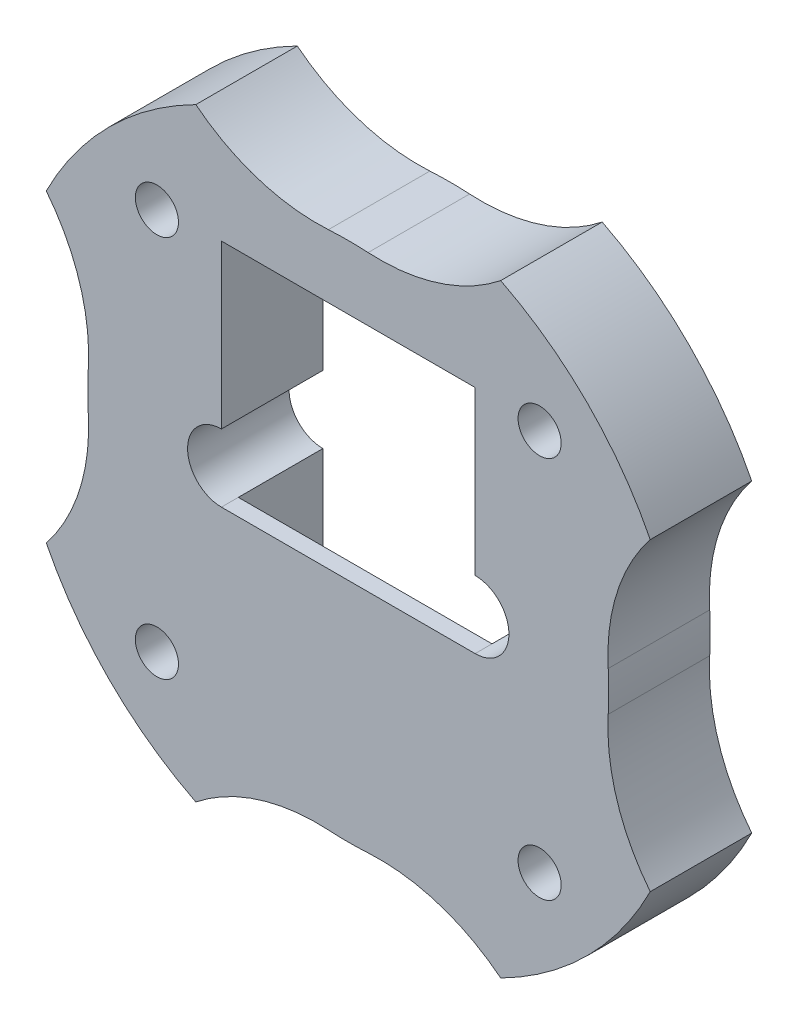
ISO-10303-21;
HEADER;
FILE_DESCRIPTION(('STEP AP214'),'2;1');
FILE_NAME('part.step','',(''),(''),'','','');
FILE_SCHEMA(('AUTOMOTIVE_DESIGN { 1 0 10303 214 1 1 1 1 }'));
ENDSEC;
DATA;
#1=APPLICATION_CONTEXT('core data for automotive mechanical design processes');
#2=APPLICATION_PROTOCOL_DEFINITION('international standard','automotive_design',2000,#1);
#3=PRODUCT_CONTEXT('',#1,'mechanical');
#4=PRODUCT('Part','Part','',(#3));
#5=PRODUCT_RELATED_PRODUCT_CATEGORY('part','',(#4));
#6=PRODUCT_DEFINITION_FORMATION('','',#4);
#7=PRODUCT_DEFINITION_CONTEXT('part definition',#1,'design');
#8=PRODUCT_DEFINITION('design','',#6,#7);
#9=PRODUCT_DEFINITION_SHAPE('','',#8);
#10=(LENGTH_UNIT() NAMED_UNIT(*) SI_UNIT(.MILLI.,.METRE.));
#11=(NAMED_UNIT(*) PLANE_ANGLE_UNIT() SI_UNIT($,.RADIAN.));
#12=(NAMED_UNIT(*) SI_UNIT($,.STERADIAN.) SOLID_ANGLE_UNIT());
#13=UNCERTAINTY_MEASURE_WITH_UNIT(LENGTH_MEASURE(1.E-05),#10,'distance_accuracy_value','');
#14=(GEOMETRIC_REPRESENTATION_CONTEXT(3) GLOBAL_UNCERTAINTY_ASSIGNED_CONTEXT((#13)) GLOBAL_UNIT_ASSIGNED_CONTEXT((#10,
#11,#12)) REPRESENTATION_CONTEXT('',''));
#15=CARTESIAN_POINT('',(0.,0.,0.));
#16=DIRECTION('',(0.,0.,1.));
#17=DIRECTION('',(1.,0.,0.));
#18=AXIS2_PLACEMENT_3D('',#15,#16,#17);
#19=CARTESIAN_POINT('',(26.8500979533182,220.651707524161,0.));
#20=DIRECTION('',(0.,0.,1.));
#21=DIRECTION('',(1.,0.,0.));
#22=AXIS2_PLACEMENT_3D('',#19,#20,#21);
#23=PLANE('',#22);
#24=CARTESIAN_POINT('',(22.6274169979694,245.127416994811,0.));
#25=DIRECTION('',(0.,0.,1.));
#26=DIRECTION('',(1.,0.,0.));
#27=AXIS2_PLACEMENT_3D('',#24,#25,#26);
#28=CIRCLE('',#27,2.55);
#29=CARTESIAN_POINT('',(25.1774169979694,245.127416994811,0.));
#30=VERTEX_POINT('',#29);
#31=EDGE_CURVE('E345',#30,#30,#28,.T.);
#32=ORIENTED_EDGE('',*,*,#31,.T.);
#33=EDGE_LOOP('',(#32));
#34=FACE_BOUND('',#33,.T.);
#35=CARTESIAN_POINT('',(22.6274169979694,199.872582998871,0.));
#36=DIRECTION('',(0.,0.,1.));
#37=DIRECTION('',(1.,0.,0.));
#38=AXIS2_PLACEMENT_3D('',#35,#36,#37);
#39=CIRCLE('',#38,2.55);
#40=CARTESIAN_POINT('',(25.1774169979694,199.872582998871,0.));
#41=VERTEX_POINT('',#40);
#42=EDGE_CURVE('E344',#41,#41,#39,.T.);
#43=ORIENTED_EDGE('',*,*,#42,.T.);
#44=EDGE_LOOP('',(#43));
#45=FACE_BOUND('',#44,.T.);
#46=CARTESIAN_POINT('',(-22.6274169979694,199.872582998871,0.));
#47=DIRECTION('',(0.,0.,1.));
#48=DIRECTION('',(1.,0.,0.));
#49=AXIS2_PLACEMENT_3D('',#46,#47,#48);
#50=CIRCLE('',#49,2.54999999999999);
#51=CARTESIAN_POINT('',(-20.0774169979694,199.872582998871,0.));
#52=VERTEX_POINT('',#51);
#53=EDGE_CURVE('E346',#52,#52,#50,.T.);
#54=ORIENTED_EDGE('',*,*,#53,.T.);
#55=EDGE_LOOP('',(#54));
#56=FACE_BOUND('',#55,.T.);
#57=CARTESIAN_POINT('',(-22.6274169979694,245.12741699481,0.));
#58=DIRECTION('',(0.,0.,1.));
#59=DIRECTION('',(1.,0.,0.));
#60=AXIS2_PLACEMENT_3D('',#57,#58,#59);
#61=CIRCLE('',#60,2.54999999999999);
#62=CARTESIAN_POINT('',(-20.0774169979694,245.12741699481,0.));
#63=VERTEX_POINT('',#62);
#64=EDGE_CURVE('E352',#63,#63,#61,.T.);
#65=ORIENTED_EDGE('',*,*,#64,.T.);
#66=EDGE_LOOP('',(#65));
#67=FACE_BOUND('',#66,.T.);
#68=CARTESIAN_POINT('',(0.,222.499999996841,0.));
#69=DIRECTION('',(0.,0.,1.));
#70=DIRECTION('',(1.,0.,0.));
#71=AXIS2_PLACEMENT_3D('',#68,#69,#70);
#72=CIRCLE('',#71,40.);
#73=CARTESIAN_POINT('',(18.0241508885566,186.791037749997,0.));
#74=VERTEX_POINT('',#73);
#75=CARTESIAN_POINT('',(35.708962246844,204.475849108284,0.));
#76=VERTEX_POINT('',#75);
#77=EDGE_CURVE('E351',#74,#76,#72,.T.);
#78=ORIENTED_EDGE('',*,*,#77,.F.);
#79=CARTESIAN_POINT('',(3.69658494535857,168.799804090204,0.));
#80=DIRECTION('',(0.,0.,-1.));
#81=DIRECTION('',(1.,0.,0.));
#82=AXIS2_PLACEMENT_3D('',#79,#80,#81);
#83=CIRCLE('',#82,22.9992094311506);
#84=CARTESIAN_POINT('',(2.34706751321916,191.759386777141,0.));
#85=VERTEX_POINT('',#84);
#86=EDGE_CURVE('E65',#85,#74,#83,.T.);
#87=ORIENTED_EDGE('',*,*,#86,.F.);
#88=CARTESIAN_POINT('',(0.,231.690468331344,0.));
#89=DIRECTION('',(0.,0.,1.));
#90=DIRECTION('',(1.,0.,0.));
#91=AXIS2_PLACEMENT_3D('',#88,#89,#90);
#92=CIRCLE('',#91,40.);
#93=CARTESIAN_POINT('',(-2.34706751321987,191.759386777141,0.));
#94=VERTEX_POINT('',#93);
#95=EDGE_CURVE('E382',#94,#85,#92,.T.);
#96=ORIENTED_EDGE('',*,*,#95,.F.);
#97=CARTESIAN_POINT('',(-3.69658494535974,168.799804090204,0.));
#98=DIRECTION('',(0.,0.,-1.));
#99=DIRECTION('',(1.,0.,0.));
#100=AXIS2_PLACEMENT_3D('',#97,#98,#99);
#101=CIRCLE('',#100,22.9992094311506);
#102=CARTESIAN_POINT('',(-18.0241508885574,186.791037749997,0.));
#103=VERTEX_POINT('',#102);
#104=EDGE_CURVE('E381',#103,#94,#101,.T.);
#105=ORIENTED_EDGE('',*,*,#104,.F.);
#106=CARTESIAN_POINT('',(0.,222.499999996841,0.));
#107=DIRECTION('',(0.,0.,1.));
#108=DIRECTION('',(1.,0.,0.));
#109=AXIS2_PLACEMENT_3D('',#106,#107,#108);
#110=CIRCLE('',#109,40.);
#111=CARTESIAN_POINT('',(-35.7089622468441,204.475849108284,0.));
#112=VERTEX_POINT('',#111);
#113=EDGE_CURVE('E377',#112,#103,#110,.T.);
#114=ORIENTED_EDGE('',*,*,#113,.F.);
#115=CARTESIAN_POINT('',(-53.7001959066365,218.803415051482,0.));
#116=DIRECTION('',(0.,0.,-1.));
#117=DIRECTION('',(1.,0.,0.));
#118=AXIS2_PLACEMENT_3D('',#115,#116,#117);
#119=CIRCLE('',#118,22.9992094311506);
#120=CARTESIAN_POINT('',(-30.7406132196998,220.152932483621,0.));
#121=VERTEX_POINT('',#120);
#122=EDGE_CURVE('E380',#121,#112,#119,.T.);
#123=ORIENTED_EDGE('',*,*,#122,.F.);
#124=CARTESIAN_POINT('',(9.1904683345029,222.499999996841,0.));
#125=DIRECTION('',(0.,0.,1.));
#126=DIRECTION('',(1.,0.,0.));
#127=AXIS2_PLACEMENT_3D('',#124,#125,#126);
#128=CIRCLE('',#127,40.);
#129=CARTESIAN_POINT('',(-30.7406132196998,224.84706751006,0.));
#130=VERTEX_POINT('',#129);
#131=EDGE_CURVE('E374',#130,#121,#128,.T.);
#132=ORIENTED_EDGE('',*,*,#131,.F.);
#133=CARTESIAN_POINT('',(-53.7001959066365,226.1965849422,0.));
#134=DIRECTION('',(0.,0.,-1.));
#135=DIRECTION('',(1.,0.,0.));
#136=AXIS2_PLACEMENT_3D('',#133,#134,#135);
#137=CIRCLE('',#136,22.9992094311506);
#138=CARTESIAN_POINT('',(-35.7089622468441,240.524150885398,0.));
#139=VERTEX_POINT('',#138);
#140=EDGE_CURVE('E373',#139,#130,#137,.T.);
#141=ORIENTED_EDGE('',*,*,#140,.F.);
#142=CARTESIAN_POINT('',(0.,222.499999996841,0.));
#143=DIRECTION('',(0.,0.,1.));
#144=DIRECTION('',(1.,0.,0.));
#145=AXIS2_PLACEMENT_3D('',#142,#143,#144);
#146=CIRCLE('',#145,40.);
#147=CARTESIAN_POINT('',(-18.0241508885569,258.208962243685,0.));
#148=VERTEX_POINT('',#147);
#149=EDGE_CURVE('E371',#148,#139,#146,.T.);
#150=ORIENTED_EDGE('',*,*,#149,.F.);
#151=CARTESIAN_POINT('',(-3.69658494535899,276.200195903477,0.));
#152=DIRECTION('',(0.,0.,-1.));
#153=DIRECTION('',(1.,0.,0.));
#154=AXIS2_PLACEMENT_3D('',#151,#152,#153);
#155=CIRCLE('',#154,22.9992094311506);
#156=CARTESIAN_POINT('',(-2.34706751321945,253.240613216541,0.));
#157=VERTEX_POINT('',#156);
#158=EDGE_CURVE('E369',#157,#148,#155,.T.);
#159=ORIENTED_EDGE('',*,*,#158,.F.);
#160=CARTESIAN_POINT('',(0.,213.309531662338,0.));
#161=DIRECTION('',(0.,0.,1.));
#162=DIRECTION('',(1.,0.,0.));
#163=AXIS2_PLACEMENT_3D('',#160,#161,#162);
#164=CIRCLE('',#163,40.);
#165=CARTESIAN_POINT('',(2.34706751321958,253.240613216541,0.));
#166=VERTEX_POINT('',#165);
#167=EDGE_CURVE('E370',#166,#157,#164,.T.);
#168=ORIENTED_EDGE('',*,*,#167,.F.);
#169=CARTESIAN_POINT('',(3.69658494535932,276.200195903477,0.));
#170=DIRECTION('',(0.,0.,-1.));
#171=DIRECTION('',(1.,0.,0.));
#172=AXIS2_PLACEMENT_3D('',#169,#170,#171);
#173=CIRCLE('',#172,22.9992094311507);
#174=CARTESIAN_POINT('',(18.0241508885571,258.208962243685,0.));
#175=VERTEX_POINT('',#174);
#176=EDGE_CURVE('E364',#175,#166,#173,.T.);
#177=ORIENTED_EDGE('',*,*,#176,.F.);
#178=CARTESIAN_POINT('',(0.,222.499999996841,0.));
#179=DIRECTION('',(0.,0.,1.));
#180=DIRECTION('',(1.,0.,0.));
#181=AXIS2_PLACEMENT_3D('',#178,#179,#180);
#182=CIRCLE('',#181,40.);
#183=CARTESIAN_POINT('',(35.708962246844,240.524150885398,0.));
#184=VERTEX_POINT('',#183);
#185=EDGE_CURVE('E361',#184,#175,#182,.T.);
#186=ORIENTED_EDGE('',*,*,#185,.F.);
#187=CARTESIAN_POINT('',(53.7001959066364,226.1965849422,0.));
#188=DIRECTION('',(0.,0.,-1.));
#189=DIRECTION('',(1.,0.,0.));
#190=AXIS2_PLACEMENT_3D('',#187,#188,#189);
#191=CIRCLE('',#190,22.9992094311506);
#192=CARTESIAN_POINT('',(30.7406132196998,224.84706751006,0.));
#193=VERTEX_POINT('',#192);
#194=EDGE_CURVE('E363',#193,#184,#191,.T.);
#195=ORIENTED_EDGE('',*,*,#194,.F.);
#196=CARTESIAN_POINT('',(-9.19046833450298,222.499999996841,0.));
#197=DIRECTION('',(0.,0.,1.));
#198=DIRECTION('',(1.,0.,0.));
#199=AXIS2_PLACEMENT_3D('',#196,#197,#198);
#200=CIRCLE('',#199,40.);
#201=CARTESIAN_POINT('',(30.7406132196998,220.152932483621,0.));
#202=VERTEX_POINT('',#201);
#203=EDGE_CURVE('E357',#202,#193,#200,.T.);
#204=ORIENTED_EDGE('',*,*,#203,.F.);
#205=CARTESIAN_POINT('',(53.7001959066364,218.803415051482,0.));
#206=DIRECTION('',(0.,0.,-1.));
#207=DIRECTION('',(1.,0.,0.));
#208=AXIS2_PLACEMENT_3D('',#205,#206,#207);
#209=CIRCLE('',#208,22.9992094311507);
#210=EDGE_CURVE('E360',#76,#202,#209,.T.);
#211=ORIENTED_EDGE('',*,*,#210,.F.);
#212=EDGE_LOOP('',(#78,#87,#96,#105,#114,#123,#132,#141,#150,#159,#168,#177,#186,#195,#204,#211));
#213=FACE_BOUND('',#212,.T.);
#214=CARTESIAN_POINT('',(-15.,222.499999996841,0.));
#215=DIRECTION('',(0.,0.,1.));
#216=DIRECTION('',(1.,0.,0.));
#217=AXIS2_PLACEMENT_3D('',#214,#215,#216);
#218=CIRCLE('',#217,4.);
#219=CARTESIAN_POINT('',(-15.,226.499999996841,0.));
#220=VERTEX_POINT('',#219);
#221=CARTESIAN_POINT('',(-15.,218.499999996841,0.));
#222=VERTEX_POINT('',#221);
#223=EDGE_CURVE('E53',#220,#222,#218,.T.);
#224=ORIENTED_EDGE('',*,*,#223,.T.);
#225=DIRECTION('',(0.,-1.,0.));
#226=VECTOR('',#225,1.);
#227=CARTESIAN_POINT('',(-15.,218.499999996841,0.));
#228=LINE('',#227,#226);
#229=CARTESIAN_POINT('',(-15.,199.25,0.));
#230=VERTEX_POINT('',#229);
#231=EDGE_CURVE('E307',#222,#230,#228,.T.);
#232=ORIENTED_EDGE('',*,*,#231,.T.);
#233=DIRECTION('',(1.,0.,0.));
#234=VECTOR('',#233,1.);
#235=CARTESIAN_POINT('',(-15.,199.25,0.));
#236=LINE('',#235,#234);
#237=CARTESIAN_POINT('',(15.,199.25,0.));
#238=VERTEX_POINT('',#237);
#239=EDGE_CURVE('E309',#230,#238,#236,.T.);
#240=ORIENTED_EDGE('',*,*,#239,.T.);
#241=DIRECTION('',(0.,1.,0.));
#242=VECTOR('',#241,1.);
#243=CARTESIAN_POINT('',(15.,199.25,0.));
#244=LINE('',#243,#242);
#245=CARTESIAN_POINT('',(15.,218.499999996841,0.));
#246=VERTEX_POINT('',#245);
#247=EDGE_CURVE('E311',#238,#246,#244,.T.);
#248=ORIENTED_EDGE('',*,*,#247,.T.);
#249=CARTESIAN_POINT('',(15.,222.499999996841,0.));
#250=DIRECTION('',(0.,0.,1.));
#251=DIRECTION('',(1.,0.,0.));
#252=AXIS2_PLACEMENT_3D('',#249,#250,#251);
#253=CIRCLE('',#252,4.);
#254=CARTESIAN_POINT('',(15.,226.499999996841,0.));
#255=VERTEX_POINT('',#254);
#256=EDGE_CURVE('E316',#246,#255,#253,.T.);
#257=ORIENTED_EDGE('',*,*,#256,.T.);
#258=DIRECTION('',(0.,1.,0.));
#259=VECTOR('',#258,1.);
#260=CARTESIAN_POINT('',(15.,226.499999996841,0.));
#261=LINE('',#260,#259);
#262=CARTESIAN_POINT('',(15.,245.749999993682,0.));
#263=VERTEX_POINT('',#262);
#264=EDGE_CURVE('E317',#255,#263,#261,.T.);
#265=ORIENTED_EDGE('',*,*,#264,.T.);
#266=DIRECTION('',(-1.,0.,0.));
#267=VECTOR('',#266,1.);
#268=CARTESIAN_POINT('',(15.,245.749999993682,0.));
#269=LINE('',#268,#267);
#270=CARTESIAN_POINT('',(-15.,245.749999993682,0.));
#271=VERTEX_POINT('',#270);
#272=EDGE_CURVE('E325',#263,#271,#269,.T.);
#273=ORIENTED_EDGE('',*,*,#272,.T.);
#274=DIRECTION('',(0.,-1.,0.));
#275=VECTOR('',#274,1.);
#276=CARTESIAN_POINT('',(-15.,245.749999993682,0.));
#277=LINE('',#276,#275);
#278=EDGE_CURVE('E298',#271,#220,#277,.T.);
#279=ORIENTED_EDGE('',*,*,#278,.T.);
#280=EDGE_LOOP('',(#224,#232,#240,#248,#257,#265,#273,#279));
#281=FACE_BOUND('',#280,.T.);
#282=ADVANCED_FACE('F39',(#34,#45,#56,#67,#213,#281),#23,.F.);
#283=CARTESIAN_POINT('',(0.,222.499999996841,10.));
#284=DIRECTION('',(0.,0.,-1.));
#285=DIRECTION('',(-1.,0.,0.));
#286=AXIS2_PLACEMENT_3D('',#283,#284,#285);
#287=CYLINDRICAL_SURFACE('',#286,40.);
#288=ORIENTED_EDGE('',*,*,#77,.T.);
#289=DIRECTION('',(0.,0.,-1.));
#290=VECTOR('',#289,1.);
#291=CARTESIAN_POINT('',(35.708962246844,204.475849108284,10.));
#292=LINE('',#291,#290);
#293=CARTESIAN_POINT('',(35.708962246844,204.475849108284,12.));
#294=VERTEX_POINT('',#293);
#295=EDGE_CURVE('E11',#294,#76,#292,.T.);
#296=ORIENTED_EDGE('',*,*,#295,.F.);
#297=CARTESIAN_POINT('',(0.,222.499999996841,12.));
#298=DIRECTION('',(0.,0.,1.));
#299=DIRECTION('',(1.,0.,0.));
#300=AXIS2_PLACEMENT_3D('',#297,#298,#299);
#301=CIRCLE('',#300,40.);
#302=CARTESIAN_POINT('',(18.0241508885566,186.791037749997,12.));
#303=VERTEX_POINT('',#302);
#304=EDGE_CURVE('E253',#303,#294,#301,.T.);
#305=ORIENTED_EDGE('',*,*,#304,.F.);
#306=DIRECTION('',(0.,0.,-1.));
#307=VECTOR('',#306,1.);
#308=CARTESIAN_POINT('',(18.0241508885566,186.791037749997,10.));
#309=LINE('',#308,#307);
#310=EDGE_CURVE('E387',#303,#74,#309,.T.);
#311=ORIENTED_EDGE('',*,*,#310,.T.);
#312=EDGE_LOOP('',(#288,#296,#305,#311));
#313=FACE_BOUND('',#312,.T.);
#314=ADVANCED_FACE('F41',(#313),#287,.T.);
#315=CARTESIAN_POINT('',(53.7001959066364,218.803415051482,10.));
#316=DIRECTION('',(0.,0.,-1.));
#317=DIRECTION('',(-1.,0.,0.));
#318=AXIS2_PLACEMENT_3D('',#315,#316,#317);
#319=CYLINDRICAL_SURFACE('',#318,22.9992094311507);
#320=ORIENTED_EDGE('',*,*,#210,.T.);
#321=DIRECTION('',(0.,0.,-1.));
#322=VECTOR('',#321,1.);
#323=CARTESIAN_POINT('',(30.7406132196998,220.152932483621,10.));
#324=LINE('',#323,#322);
#325=CARTESIAN_POINT('',(30.7406132196997,220.152932483621,12.));
#326=VERTEX_POINT('',#325);
#327=EDGE_CURVE('E50',#326,#202,#324,.T.);
#328=ORIENTED_EDGE('',*,*,#327,.F.);
#329=CARTESIAN_POINT('',(53.7001959066364,218.803415051482,12.));
#330=DIRECTION('',(0.,0.,-1.));
#331=DIRECTION('',(1.,0.,0.));
#332=AXIS2_PLACEMENT_3D('',#329,#330,#331);
#333=CIRCLE('',#332,22.9992094311507);
#334=EDGE_CURVE('E255',#294,#326,#333,.T.);
#335=ORIENTED_EDGE('',*,*,#334,.F.);
#336=ORIENTED_EDGE('',*,*,#295,.T.);
#337=EDGE_LOOP('',(#320,#328,#335,#336));
#338=FACE_BOUND('',#337,.T.);
#339=ADVANCED_FACE('F488',(#338),#319,.F.);
#340=CARTESIAN_POINT('',(-9.19046833450298,222.499999996841,10.));
#341=DIRECTION('',(0.,0.,-1.));
#342=DIRECTION('',(-1.,0.,0.));
#343=AXIS2_PLACEMENT_3D('',#340,#341,#342);
#344=CYLINDRICAL_SURFACE('',#343,40.);
#345=ORIENTED_EDGE('',*,*,#203,.T.);
#346=DIRECTION('',(0.,0.,-1.));
#347=VECTOR('',#346,1.);
#348=CARTESIAN_POINT('',(30.7406132196998,224.84706751006,10.));
#349=LINE('',#348,#347);
#350=CARTESIAN_POINT('',(30.7406132196997,224.84706751006,12.));
#351=VERTEX_POINT('',#350);
#352=EDGE_CURVE('E421',#351,#193,#349,.T.);
#353=ORIENTED_EDGE('',*,*,#352,.F.);
#354=CARTESIAN_POINT('',(-9.19046833450298,222.499999996841,12.));
#355=DIRECTION('',(0.,0.,1.));
#356=DIRECTION('',(1.,0.,0.));
#357=AXIS2_PLACEMENT_3D('',#354,#355,#356);
#358=CIRCLE('',#357,40.);
#359=EDGE_CURVE('E260',#326,#351,#358,.T.);
#360=ORIENTED_EDGE('',*,*,#359,.F.);
#361=ORIENTED_EDGE('',*,*,#327,.T.);
#362=EDGE_LOOP('',(#345,#353,#360,#361));
#363=FACE_BOUND('',#362,.T.);
#364=ADVANCED_FACE('F427',(#363),#344,.T.);
#365=CARTESIAN_POINT('',(53.7001959066364,226.1965849422,10.));
#366=DIRECTION('',(0.,0.,-1.));
#367=DIRECTION('',(-1.,0.,0.));
#368=AXIS2_PLACEMENT_3D('',#365,#366,#367);
#369=CYLINDRICAL_SURFACE('',#368,22.9992094311506);
#370=ORIENTED_EDGE('',*,*,#194,.T.);
#371=DIRECTION('',(0.,0.,-1.));
#372=VECTOR('',#371,1.);
#373=CARTESIAN_POINT('',(35.708962246844,240.524150885398,10.));
#374=LINE('',#373,#372);
#375=CARTESIAN_POINT('',(35.708962246844,240.524150885398,12.));
#376=VERTEX_POINT('',#375);
#377=EDGE_CURVE('E419',#376,#184,#374,.T.);
#378=ORIENTED_EDGE('',*,*,#377,.F.);
#379=CARTESIAN_POINT('',(53.7001959066364,226.1965849422,12.));
#380=DIRECTION('',(0.,0.,-1.));
#381=DIRECTION('',(1.,0.,0.));
#382=AXIS2_PLACEMENT_3D('',#379,#380,#381);
#383=CIRCLE('',#382,22.9992094311506);
#384=EDGE_CURVE('E257',#351,#376,#383,.T.);
#385=ORIENTED_EDGE('',*,*,#384,.F.);
#386=ORIENTED_EDGE('',*,*,#352,.T.);
#387=EDGE_LOOP('',(#370,#378,#385,#386));
#388=FACE_BOUND('',#387,.T.);
#389=ADVANCED_FACE('F438',(#388),#369,.F.);
#390=CARTESIAN_POINT('',(0.,222.499999996841,10.));
#391=DIRECTION('',(0.,0.,-1.));
#392=DIRECTION('',(-1.,0.,0.));
#393=AXIS2_PLACEMENT_3D('',#390,#391,#392);
#394=CYLINDRICAL_SURFACE('',#393,40.);
#395=ORIENTED_EDGE('',*,*,#185,.T.);
#396=DIRECTION('',(0.,0.,-1.));
#397=VECTOR('',#396,1.);
#398=CARTESIAN_POINT('',(18.0241508885571,258.208962243685,10.));
#399=LINE('',#398,#397);
#400=CARTESIAN_POINT('',(18.0241508885571,258.208962243685,12.));
#401=VERTEX_POINT('',#400);
#402=EDGE_CURVE('E417',#401,#175,#399,.T.);
#403=ORIENTED_EDGE('',*,*,#402,.F.);
#404=CARTESIAN_POINT('',(0.,222.499999996841,12.));
#405=DIRECTION('',(0.,0.,1.));
#406=DIRECTION('',(1.,0.,0.));
#407=AXIS2_PLACEMENT_3D('',#404,#405,#406);
#408=CIRCLE('',#407,40.);
#409=EDGE_CURVE('E263',#376,#401,#408,.T.);
#410=ORIENTED_EDGE('',*,*,#409,.F.);
#411=ORIENTED_EDGE('',*,*,#377,.T.);
#412=EDGE_LOOP('',(#395,#403,#410,#411));
#413=FACE_BOUND('',#412,.T.);
#414=ADVANCED_FACE('F444',(#413),#394,.T.);
#415=CARTESIAN_POINT('',(3.69658494535932,276.200195903477,10.));
#416=DIRECTION('',(0.,0.,-1.));
#417=DIRECTION('',(-1.,0.,0.));
#418=AXIS2_PLACEMENT_3D('',#415,#416,#417);
#419=CYLINDRICAL_SURFACE('',#418,22.9992094311507);
#420=ORIENTED_EDGE('',*,*,#176,.T.);
#421=DIRECTION('',(0.,0.,-1.));
#422=VECTOR('',#421,1.);
#423=CARTESIAN_POINT('',(2.34706751321958,253.240613216541,10.));
#424=LINE('',#423,#422);
#425=CARTESIAN_POINT('',(2.34706751321957,253.240613216541,12.));
#426=VERTEX_POINT('',#425);
#427=EDGE_CURVE('E412',#426,#166,#424,.T.);
#428=ORIENTED_EDGE('',*,*,#427,.F.);
#429=CARTESIAN_POINT('',(3.69658494535932,276.200195903477,12.));
#430=DIRECTION('',(0.,0.,-1.));
#431=DIRECTION('',(1.,0.,0.));
#432=AXIS2_PLACEMENT_3D('',#429,#430,#431);
#433=CIRCLE('',#432,22.9992094311507);
#434=EDGE_CURVE('E266',#401,#426,#433,.T.);
#435=ORIENTED_EDGE('',*,*,#434,.F.);
#436=ORIENTED_EDGE('',*,*,#402,.T.);
#437=EDGE_LOOP('',(#420,#428,#435,#436));
#438=FACE_BOUND('',#437,.T.);
#439=ADVANCED_FACE('F449',(#438),#419,.F.);
#440=CARTESIAN_POINT('',(0.,213.309531662338,10.));
#441=DIRECTION('',(0.,0.,-1.));
#442=DIRECTION('',(-1.,0.,0.));
#443=AXIS2_PLACEMENT_3D('',#440,#441,#442);
#444=CYLINDRICAL_SURFACE('',#443,40.);
#445=ORIENTED_EDGE('',*,*,#167,.T.);
#446=DIRECTION('',(0.,0.,-1.));
#447=VECTOR('',#446,1.);
#448=CARTESIAN_POINT('',(-2.34706751321945,253.240613216541,10.));
#449=LINE('',#448,#447);
#450=CARTESIAN_POINT('',(-2.34706751321945,253.240613216541,12.));
#451=VERTEX_POINT('',#450);
#452=EDGE_CURVE('E411',#451,#157,#449,.T.);
#453=ORIENTED_EDGE('',*,*,#452,.F.);
#454=CARTESIAN_POINT('',(0.,213.309531662338,12.));
#455=DIRECTION('',(0.,0.,1.));
#456=DIRECTION('',(1.,0.,0.));
#457=AXIS2_PLACEMENT_3D('',#454,#455,#456);
#458=CIRCLE('',#457,40.);
#459=EDGE_CURVE('E267',#426,#451,#458,.T.);
#460=ORIENTED_EDGE('',*,*,#459,.F.);
#461=ORIENTED_EDGE('',*,*,#427,.T.);
#462=EDGE_LOOP('',(#445,#453,#460,#461));
#463=FACE_BOUND('',#462,.T.);
#464=ADVANCED_FACE('F451',(#463),#444,.T.);
#465=CARTESIAN_POINT('',(-3.69658494535899,276.200195903477,10.));
#466=DIRECTION('',(0.,0.,-1.));
#467=DIRECTION('',(-1.,0.,0.));
#468=AXIS2_PLACEMENT_3D('',#465,#466,#467);
#469=CYLINDRICAL_SURFACE('',#468,22.9992094311506);
#470=ORIENTED_EDGE('',*,*,#158,.T.);
#471=DIRECTION('',(0.,0.,-1.));
#472=VECTOR('',#471,1.);
#473=CARTESIAN_POINT('',(-18.0241508885569,258.208962243685,10.));
#474=LINE('',#473,#472);
#475=CARTESIAN_POINT('',(-18.0241508885569,258.208962243685,12.));
#476=VERTEX_POINT('',#475);
#477=EDGE_CURVE('E409',#476,#148,#474,.T.);
#478=ORIENTED_EDGE('',*,*,#477,.F.);
#479=CARTESIAN_POINT('',(-3.69658494535899,276.200195903477,12.));
#480=DIRECTION('',(0.,0.,-1.));
#481=DIRECTION('',(1.,0.,0.));
#482=AXIS2_PLACEMENT_3D('',#479,#480,#481);
#483=CIRCLE('',#482,22.9992094311507);
#484=EDGE_CURVE('E275',#451,#476,#483,.T.);
#485=ORIENTED_EDGE('',*,*,#484,.F.);
#486=ORIENTED_EDGE('',*,*,#452,.T.);
#487=EDGE_LOOP('',(#470,#478,#485,#486));
#488=FACE_BOUND('',#487,.T.);
#489=ADVANCED_FACE('F457',(#488),#469,.F.);
#490=CARTESIAN_POINT('',(0.,222.499999996841,10.));
#491=DIRECTION('',(0.,0.,-1.));
#492=DIRECTION('',(-1.,0.,0.));
#493=AXIS2_PLACEMENT_3D('',#490,#491,#492);
#494=CYLINDRICAL_SURFACE('',#493,40.);
#495=ORIENTED_EDGE('',*,*,#149,.T.);
#496=DIRECTION('',(0.,0.,-1.));
#497=VECTOR('',#496,1.);
#498=CARTESIAN_POINT('',(-35.7089622468441,240.524150885398,10.));
#499=LINE('',#498,#497);
#500=CARTESIAN_POINT('',(-35.7089622468441,240.524150885398,12.));
#501=VERTEX_POINT('',#500);
#502=EDGE_CURVE('E403',#501,#139,#499,.T.);
#503=ORIENTED_EDGE('',*,*,#502,.F.);
#504=CARTESIAN_POINT('',(0.,222.499999996841,12.));
#505=DIRECTION('',(0.,0.,1.));
#506=DIRECTION('',(1.,0.,0.));
#507=AXIS2_PLACEMENT_3D('',#504,#505,#506);
#508=CIRCLE('',#507,40.);
#509=EDGE_CURVE('E274',#476,#501,#508,.T.);
#510=ORIENTED_EDGE('',*,*,#509,.F.);
#511=ORIENTED_EDGE('',*,*,#477,.T.);
#512=EDGE_LOOP('',(#495,#503,#510,#511));
#513=FACE_BOUND('',#512,.T.);
#514=ADVANCED_FACE('F458',(#513),#494,.T.);
#515=CARTESIAN_POINT('',(-53.7001959066365,226.1965849422,10.));
#516=DIRECTION('',(0.,0.,-1.));
#517=DIRECTION('',(-1.,0.,0.));
#518=AXIS2_PLACEMENT_3D('',#515,#516,#517);
#519=CYLINDRICAL_SURFACE('',#518,22.9992094311506);
#520=ORIENTED_EDGE('',*,*,#140,.T.);
#521=DIRECTION('',(0.,0.,-1.));
#522=VECTOR('',#521,1.);
#523=CARTESIAN_POINT('',(-30.7406132196998,224.84706751006,10.));
#524=LINE('',#523,#522);
#525=CARTESIAN_POINT('',(-30.7406132196998,224.84706751006,12.));
#526=VERTEX_POINT('',#525);
#527=EDGE_CURVE('E405',#526,#130,#524,.T.);
#528=ORIENTED_EDGE('',*,*,#527,.F.);
#529=CARTESIAN_POINT('',(-53.7001959066365,226.1965849422,12.));
#530=DIRECTION('',(0.,0.,-1.));
#531=DIRECTION('',(1.,0.,0.));
#532=AXIS2_PLACEMENT_3D('',#529,#530,#531);
#533=CIRCLE('',#532,22.9992094311506);
#534=EDGE_CURVE('E279',#501,#526,#533,.T.);
#535=ORIENTED_EDGE('',*,*,#534,.F.);
#536=ORIENTED_EDGE('',*,*,#502,.T.);
#537=EDGE_LOOP('',(#520,#528,#535,#536));
#538=FACE_BOUND('',#537,.T.);
#539=ADVANCED_FACE('F461',(#538),#519,.F.);
#540=CARTESIAN_POINT('',(9.1904683345029,222.499999996841,10.));
#541=DIRECTION('',(0.,0.,-1.));
#542=DIRECTION('',(-1.,0.,0.));
#543=AXIS2_PLACEMENT_3D('',#540,#541,#542);
#544=CYLINDRICAL_SURFACE('',#543,40.);
#545=ORIENTED_EDGE('',*,*,#131,.T.);
#546=DIRECTION('',(0.,0.,-1.));
#547=VECTOR('',#546,1.);
#548=CARTESIAN_POINT('',(-30.7406132196998,220.152932483621,10.));
#549=LINE('',#548,#547);
#550=CARTESIAN_POINT('',(-30.7406132196998,220.152932483621,12.));
#551=VERTEX_POINT('',#550);
#552=EDGE_CURVE('E397',#551,#121,#549,.T.);
#553=ORIENTED_EDGE('',*,*,#552,.F.);
#554=CARTESIAN_POINT('',(9.1904683345029,222.499999996841,12.));
#555=DIRECTION('',(0.,0.,1.));
#556=DIRECTION('',(1.,0.,0.));
#557=AXIS2_PLACEMENT_3D('',#554,#555,#556);
#558=CIRCLE('',#557,40.);
#559=EDGE_CURVE('E282',#526,#551,#558,.T.);
#560=ORIENTED_EDGE('',*,*,#559,.F.);
#561=ORIENTED_EDGE('',*,*,#527,.T.);
#562=EDGE_LOOP('',(#545,#553,#560,#561));
#563=FACE_BOUND('',#562,.T.);
#564=ADVANCED_FACE('F470',(#563),#544,.T.);
#565=CARTESIAN_POINT('',(-53.7001959066365,218.803415051482,10.));
#566=DIRECTION('',(0.,0.,-1.));
#567=DIRECTION('',(-1.,0.,0.));
#568=AXIS2_PLACEMENT_3D('',#565,#566,#567);
#569=CYLINDRICAL_SURFACE('',#568,22.9992094311506);
#570=ORIENTED_EDGE('',*,*,#122,.T.);
#571=DIRECTION('',(0.,0.,-1.));
#572=VECTOR('',#571,1.);
#573=CARTESIAN_POINT('',(-35.7089622468441,204.475849108284,10.));
#574=LINE('',#573,#572);
#575=CARTESIAN_POINT('',(-35.7089622468441,204.475849108284,12.));
#576=VERTEX_POINT('',#575);
#577=EDGE_CURVE('E396',#576,#112,#574,.T.);
#578=ORIENTED_EDGE('',*,*,#577,.F.);
#579=CARTESIAN_POINT('',(-53.7001959066365,218.803415051482,12.));
#580=DIRECTION('',(0.,0.,-1.));
#581=DIRECTION('',(1.,0.,0.));
#582=AXIS2_PLACEMENT_3D('',#579,#580,#581);
#583=CIRCLE('',#582,22.9992094311506);
#584=EDGE_CURVE('E281',#551,#576,#583,.T.);
#585=ORIENTED_EDGE('',*,*,#584,.F.);
#586=ORIENTED_EDGE('',*,*,#552,.T.);
#587=EDGE_LOOP('',(#570,#578,#585,#586));
#588=FACE_BOUND('',#587,.T.);
#589=ADVANCED_FACE('F472',(#588),#569,.F.);
#590=CARTESIAN_POINT('',(0.,222.499999996841,10.));
#591=DIRECTION('',(0.,0.,-1.));
#592=DIRECTION('',(-1.,0.,0.));
#593=AXIS2_PLACEMENT_3D('',#590,#591,#592);
#594=CYLINDRICAL_SURFACE('',#593,40.);
#595=ORIENTED_EDGE('',*,*,#113,.T.);
#596=DIRECTION('',(0.,0.,-1.));
#597=VECTOR('',#596,1.);
#598=CARTESIAN_POINT('',(-18.0241508885574,186.791037749997,10.));
#599=LINE('',#598,#597);
#600=CARTESIAN_POINT('',(-18.0241508885574,186.791037749997,12.));
#601=VERTEX_POINT('',#600);
#602=EDGE_CURVE('E394',#601,#103,#599,.T.);
#603=ORIENTED_EDGE('',*,*,#602,.F.);
#604=CARTESIAN_POINT('',(0.,222.499999996841,12.));
#605=DIRECTION('',(0.,0.,1.));
#606=DIRECTION('',(1.,0.,0.));
#607=AXIS2_PLACEMENT_3D('',#604,#605,#606);
#608=CIRCLE('',#607,40.);
#609=EDGE_CURVE('E290',#576,#601,#608,.T.);
#610=ORIENTED_EDGE('',*,*,#609,.F.);
#611=ORIENTED_EDGE('',*,*,#577,.T.);
#612=EDGE_LOOP('',(#595,#603,#610,#611));
#613=FACE_BOUND('',#612,.T.);
#614=ADVANCED_FACE('F478',(#613),#594,.T.);
#615=CARTESIAN_POINT('',(-3.69658494535974,168.799804090204,10.));
#616=DIRECTION('',(0.,0.,-1.));
#617=DIRECTION('',(-1.,0.,0.));
#618=AXIS2_PLACEMENT_3D('',#615,#616,#617);
#619=CYLINDRICAL_SURFACE('',#618,22.9992094311506);
#620=ORIENTED_EDGE('',*,*,#104,.T.);
#621=DIRECTION('',(0.,0.,-1.));
#622=VECTOR('',#621,1.);
#623=CARTESIAN_POINT('',(-2.34706751321987,191.759386777141,10.));
#624=LINE('',#623,#622);
#625=CARTESIAN_POINT('',(-2.34706751321987,191.759386777141,12.));
#626=VERTEX_POINT('',#625);
#627=EDGE_CURVE('E388',#626,#94,#624,.T.);
#628=ORIENTED_EDGE('',*,*,#627,.F.);
#629=CARTESIAN_POINT('',(-3.69658494535974,168.799804090204,12.));
#630=DIRECTION('',(0.,0.,-1.));
#631=DIRECTION('',(1.,0.,0.));
#632=AXIS2_PLACEMENT_3D('',#629,#630,#631);
#633=CIRCLE('',#632,22.9992094311506);
#634=EDGE_CURVE('E289',#601,#626,#633,.T.);
#635=ORIENTED_EDGE('',*,*,#634,.F.);
#636=ORIENTED_EDGE('',*,*,#602,.T.);
#637=EDGE_LOOP('',(#620,#628,#635,#636));
#638=FACE_BOUND('',#637,.T.);
#639=ADVANCED_FACE('F477',(#638),#619,.F.);
#640=CARTESIAN_POINT('',(0.,231.690468331344,10.));
#641=DIRECTION('',(0.,0.,-1.));
#642=DIRECTION('',(-1.,0.,0.));
#643=AXIS2_PLACEMENT_3D('',#640,#641,#642);
#644=CYLINDRICAL_SURFACE('',#643,40.);
#645=ORIENTED_EDGE('',*,*,#95,.T.);
#646=DIRECTION('',(0.,0.,-1.));
#647=VECTOR('',#646,1.);
#648=CARTESIAN_POINT('',(2.34706751321916,191.759386777141,10.));
#649=LINE('',#648,#647);
#650=CARTESIAN_POINT('',(2.34706751321915,191.759386777141,12.));
#651=VERTEX_POINT('',#650);
#652=EDGE_CURVE('E389',#651,#85,#649,.T.);
#653=ORIENTED_EDGE('',*,*,#652,.F.);
#654=CARTESIAN_POINT('',(0.,231.690468331344,12.));
#655=DIRECTION('',(0.,0.,1.));
#656=DIRECTION('',(1.,0.,0.));
#657=AXIS2_PLACEMENT_3D('',#654,#655,#656);
#658=CIRCLE('',#657,40.);
#659=EDGE_CURVE('E291',#626,#651,#658,.T.);
#660=ORIENTED_EDGE('',*,*,#659,.F.);
#661=ORIENTED_EDGE('',*,*,#627,.T.);
#662=EDGE_LOOP('',(#645,#653,#660,#661));
#663=FACE_BOUND('',#662,.T.);
#664=ADVANCED_FACE('F483',(#663),#644,.T.);
#665=CARTESIAN_POINT('',(3.69658494535857,168.799804090204,10.));
#666=DIRECTION('',(0.,0.,-1.));
#667=DIRECTION('',(-1.,0.,0.));
#668=AXIS2_PLACEMENT_3D('',#665,#666,#667);
#669=CYLINDRICAL_SURFACE('',#668,22.9992094311506);
#670=ORIENTED_EDGE('',*,*,#86,.T.);
#671=ORIENTED_EDGE('',*,*,#310,.F.);
#672=CARTESIAN_POINT('',(3.69658494535857,168.799804090204,12.));
#673=DIRECTION('',(0.,0.,-1.));
#674=DIRECTION('',(1.,0.,0.));
#675=AXIS2_PLACEMENT_3D('',#672,#673,#674);
#676=CIRCLE('',#675,22.9992094311506);
#677=EDGE_CURVE('E223',#651,#303,#676,.T.);
#678=ORIENTED_EDGE('',*,*,#677,.F.);
#679=ORIENTED_EDGE('',*,*,#652,.T.);
#680=EDGE_LOOP('',(#670,#671,#678,#679));
#681=FACE_BOUND('',#680,.T.);
#682=ADVANCED_FACE('F490',(#681),#669,.F.);
#683=CARTESIAN_POINT('',(-22.6274169979694,245.12741699481,10.));
#684=DIRECTION('',(0.,0.,-1.));
#685=DIRECTION('',(-1.,0.,0.));
#686=AXIS2_PLACEMENT_3D('',#683,#684,#685);
#687=CYLINDRICAL_SURFACE('',#686,2.54999999999999);
#688=ORIENTED_EDGE('',*,*,#64,.F.);
#689=EDGE_LOOP('',(#688));
#690=FACE_BOUND('',#689,.T.);
#691=CARTESIAN_POINT('',(-22.6274169979694,245.12741699481,12.));
#692=DIRECTION('',(0.,0.,1.));
#693=DIRECTION('',(1.,0.,0.));
#694=AXIS2_PLACEMENT_3D('',#691,#692,#693);
#695=CIRCLE('',#694,2.54999999999999);
#696=CARTESIAN_POINT('',(-20.0774169979694,245.12741699481,12.));
#697=VERTEX_POINT('',#696);
#698=EDGE_CURVE('E250',#697,#697,#695,.T.);
#699=ORIENTED_EDGE('',*,*,#698,.T.);
#700=EDGE_LOOP('',(#699));
#701=FACE_BOUND('',#700,.T.);
#702=ADVANCED_FACE('F504',(#690,#701),#687,.F.);
#703=CARTESIAN_POINT('',(-22.6274169979694,199.872582998871,10.));
#704=DIRECTION('',(0.,0.,-1.));
#705=DIRECTION('',(-1.,0.,0.));
#706=AXIS2_PLACEMENT_3D('',#703,#704,#705);
#707=CYLINDRICAL_SURFACE('',#706,2.54999999999999);
#708=ORIENTED_EDGE('',*,*,#53,.F.);
#709=EDGE_LOOP('',(#708));
#710=FACE_BOUND('',#709,.T.);
#711=CARTESIAN_POINT('',(-22.6274169979694,199.872582998871,12.));
#712=DIRECTION('',(0.,0.,1.));
#713=DIRECTION('',(1.,0.,0.));
#714=AXIS2_PLACEMENT_3D('',#711,#712,#713);
#715=CIRCLE('',#714,2.54999999999999);
#716=CARTESIAN_POINT('',(-20.0774169979694,199.872582998871,12.));
#717=VERTEX_POINT('',#716);
#718=EDGE_CURVE('E865',#717,#717,#715,.T.);
#719=ORIENTED_EDGE('',*,*,#718,.T.);
#720=EDGE_LOOP('',(#719));
#721=FACE_BOUND('',#720,.T.);
#722=ADVANCED_FACE('F601',(#710,#721),#707,.F.);
#723=CARTESIAN_POINT('',(22.6274169979694,199.872582998871,10.));
#724=DIRECTION('',(0.,0.,-1.));
#725=DIRECTION('',(-1.,0.,0.));
#726=AXIS2_PLACEMENT_3D('',#723,#724,#725);
#727=CYLINDRICAL_SURFACE('',#726,2.55);
#728=ORIENTED_EDGE('',*,*,#42,.F.);
#729=EDGE_LOOP('',(#728));
#730=FACE_BOUND('',#729,.T.);
#731=CARTESIAN_POINT('',(22.6274169979694,199.872582998871,12.));
#732=DIRECTION('',(0.,0.,1.));
#733=DIRECTION('',(1.,0.,0.));
#734=AXIS2_PLACEMENT_3D('',#731,#732,#733);
#735=CIRCLE('',#734,2.54999999999999);
#736=CARTESIAN_POINT('',(25.1774169979694,199.872582998871,12.));
#737=VERTEX_POINT('',#736);
#738=EDGE_CURVE('E856',#737,#737,#735,.T.);
#739=ORIENTED_EDGE('',*,*,#738,.T.);
#740=EDGE_LOOP('',(#739));
#741=FACE_BOUND('',#740,.T.);
#742=ADVANCED_FACE('F606',(#730,#741),#727,.F.);
#743=CARTESIAN_POINT('',(22.6274169979694,245.127416994811,10.));
#744=DIRECTION('',(0.,0.,-1.));
#745=DIRECTION('',(-1.,0.,0.));
#746=AXIS2_PLACEMENT_3D('',#743,#744,#745);
#747=CYLINDRICAL_SURFACE('',#746,2.55);
#748=ORIENTED_EDGE('',*,*,#31,.F.);
#749=EDGE_LOOP('',(#748));
#750=FACE_BOUND('',#749,.T.);
#751=CARTESIAN_POINT('',(22.6274169979694,245.127416994811,12.));
#752=DIRECTION('',(0.,0.,1.));
#753=DIRECTION('',(1.,0.,0.));
#754=AXIS2_PLACEMENT_3D('',#751,#752,#753);
#755=CIRCLE('',#754,2.54999999999999);
#756=CARTESIAN_POINT('',(25.1774169979694,245.127416994811,12.));
#757=VERTEX_POINT('',#756);
#758=EDGE_CURVE('E870',#757,#757,#755,.T.);
#759=ORIENTED_EDGE('',*,*,#758,.T.);
#760=EDGE_LOOP('',(#759));
#761=FACE_BOUND('',#760,.T.);
#762=ADVANCED_FACE('F620',(#750,#761),#747,.F.);
#763=CARTESIAN_POINT('',(-15.,222.499999996841,10.));
#764=DIRECTION('',(0.,0.,-1.));
#765=DIRECTION('',(-1.,0.,0.));
#766=AXIS2_PLACEMENT_3D('',#763,#764,#765);
#767=CYLINDRICAL_SURFACE('',#766,4.);
#768=ORIENTED_EDGE('',*,*,#223,.F.);
#769=DIRECTION('',(0.,0.,-1.));
#770=VECTOR('',#769,1.);
#771=CARTESIAN_POINT('',(-15.,226.499999996841,10.));
#772=LINE('',#771,#770);
#773=CARTESIAN_POINT('',(-15.,226.499999996841,12.));
#774=VERTEX_POINT('',#773);
#775=EDGE_CURVE('E215',#774,#220,#772,.T.);
#776=ORIENTED_EDGE('',*,*,#775,.F.);
#777=CARTESIAN_POINT('',(-15.,222.499999996841,12.));
#778=DIRECTION('',(0.,0.,1.));
#779=DIRECTION('',(1.,0.,0.));
#780=AXIS2_PLACEMENT_3D('',#777,#778,#779);
#781=CIRCLE('',#780,4.);
#782=CARTESIAN_POINT('',(-15.,218.499999996841,12.));
#783=VERTEX_POINT('',#782);
#784=EDGE_CURVE('E210',#774,#783,#781,.T.);
#785=ORIENTED_EDGE('',*,*,#784,.T.);
#786=DIRECTION('',(0.,0.,-1.));
#787=VECTOR('',#786,1.);
#788=CARTESIAN_POINT('',(-15.,218.499999996841,12.));
#789=LINE('',#788,#787);
#790=CARTESIAN_POINT('',(-15.,218.499999996841,10.));
#791=VERTEX_POINT('',#790);
#792=EDGE_CURVE('E209',#783,#791,#789,.T.);
#793=ORIENTED_EDGE('',*,*,#792,.T.);
#794=DIRECTION('',(0.,0.,-1.));
#795=VECTOR('',#794,1.);
#796=CARTESIAN_POINT('',(-15.,218.499999996841,10.));
#797=LINE('',#796,#795);
#798=EDGE_CURVE('E338',#791,#222,#797,.T.);
#799=ORIENTED_EDGE('',*,*,#798,.T.);
#800=EDGE_LOOP('',(#768,#776,#785,#793,#799));
#801=FACE_BOUND('',#800,.T.);
#802=ADVANCED_FACE('F207',(#801),#767,.F.);
#803=CARTESIAN_POINT('',(-15.,218.499999996841,10.));
#804=DIRECTION('',(1.,0.,0.));
#805=DIRECTION('',(0.,1.,0.));
#806=AXIS2_PLACEMENT_3D('',#803,#804,#805);
#807=PLANE('',#806);
#808=ORIENTED_EDGE('',*,*,#231,.F.);
#809=ORIENTED_EDGE('',*,*,#798,.F.);
#810=DIRECTION('',(0.,-1.,0.));
#811=VECTOR('',#810,1.);
#812=CARTESIAN_POINT('',(-15.,218.499999996841,10.));
#813=LINE('',#812,#811);
#814=CARTESIAN_POINT('',(-15.,199.25,10.));
#815=VERTEX_POINT('',#814);
#816=EDGE_CURVE('E297',#791,#815,#813,.T.);
#817=ORIENTED_EDGE('',*,*,#816,.T.);
#818=DIRECTION('',(0.,0.,-1.));
#819=VECTOR('',#818,1.);
#820=CARTESIAN_POINT('',(-15.,199.25,10.));
#821=LINE('',#820,#819);
#822=EDGE_CURVE('E339',#815,#230,#821,.T.);
#823=ORIENTED_EDGE('',*,*,#822,.T.);
#824=EDGE_LOOP('',(#808,#809,#817,#823));
#825=FACE_BOUND('',#824,.T.);
#826=ADVANCED_FACE('F632',(#825),#807,.T.);
#827=CARTESIAN_POINT('',(-15.,199.25,10.));
#828=DIRECTION('',(0.,1.,0.));
#829=DIRECTION('',(0.,0.,1.));
#830=AXIS2_PLACEMENT_3D('',#827,#828,#829);
#831=PLANE('',#830);
#832=ORIENTED_EDGE('',*,*,#239,.F.);
#833=ORIENTED_EDGE('',*,*,#822,.F.);
#834=DIRECTION('',(1.,0.,0.));
#835=VECTOR('',#834,1.);
#836=CARTESIAN_POINT('',(-15.,199.25,10.));
#837=LINE('',#836,#835);
#838=CARTESIAN_POINT('',(15.,199.25,10.));
#839=VERTEX_POINT('',#838);
#840=EDGE_CURVE('E296',#815,#839,#837,.T.);
#841=ORIENTED_EDGE('',*,*,#840,.T.);
#842=DIRECTION('',(0.,0.,-1.));
#843=VECTOR('',#842,1.);
#844=CARTESIAN_POINT('',(15.,199.25,10.));
#845=LINE('',#844,#843);
#846=EDGE_CURVE('E337',#839,#238,#845,.T.);
#847=ORIENTED_EDGE('',*,*,#846,.T.);
#848=EDGE_LOOP('',(#832,#833,#841,#847));
#849=FACE_BOUND('',#848,.T.);
#850=ADVANCED_FACE('F641',(#849),#831,.T.);
#851=CARTESIAN_POINT('',(15.,199.25,10.));
#852=DIRECTION('',(-1.,0.,0.));
#853=DIRECTION('',(0.,-1.,0.));
#854=AXIS2_PLACEMENT_3D('',#851,#852,#853);
#855=PLANE('',#854);
#856=ORIENTED_EDGE('',*,*,#247,.F.);
#857=ORIENTED_EDGE('',*,*,#846,.F.);
#858=DIRECTION('',(0.,1.,0.));
#859=VECTOR('',#858,1.);
#860=CARTESIAN_POINT('',(15.,199.25,10.));
#861=LINE('',#860,#859);
#862=CARTESIAN_POINT('',(15.,218.499999996841,10.));
#863=VERTEX_POINT('',#862);
#864=EDGE_CURVE('E303',#839,#863,#861,.T.);
#865=ORIENTED_EDGE('',*,*,#864,.T.);
#866=DIRECTION('',(0.,0.,-1.));
#867=VECTOR('',#866,1.);
#868=CARTESIAN_POINT('',(15.,218.499999996841,10.));
#869=LINE('',#868,#867);
#870=EDGE_CURVE('E331',#863,#246,#869,.T.);
#871=ORIENTED_EDGE('',*,*,#870,.T.);
#872=EDGE_LOOP('',(#856,#857,#865,#871));
#873=FACE_BOUND('',#872,.T.);
#874=ADVANCED_FACE('F655',(#873),#855,.T.);
#875=CARTESIAN_POINT('',(15.,222.499999996841,10.));
#876=DIRECTION('',(0.,0.,-1.));
#877=DIRECTION('',(-1.,0.,0.));
#878=AXIS2_PLACEMENT_3D('',#875,#876,#877);
#879=CYLINDRICAL_SURFACE('',#878,4.);
#880=ORIENTED_EDGE('',*,*,#256,.F.);
#881=ORIENTED_EDGE('',*,*,#870,.F.);
#882=DIRECTION('',(0.,0.,-1.));
#883=VECTOR('',#882,1.);
#884=CARTESIAN_POINT('',(15.,218.499999996841,12.));
#885=LINE('',#884,#883);
#886=CARTESIAN_POINT('',(15.,218.499999996841,12.));
#887=VERTEX_POINT('',#886);
#888=EDGE_CURVE('E227',#887,#863,#885,.T.);
#889=ORIENTED_EDGE('',*,*,#888,.F.);
#890=CARTESIAN_POINT('',(15.,222.499999996841,12.));
#891=DIRECTION('',(0.,0.,1.));
#892=DIRECTION('',(1.,0.,0.));
#893=AXIS2_PLACEMENT_3D('',#890,#891,#892);
#894=CIRCLE('',#893,4.);
#895=CARTESIAN_POINT('',(15.,226.499999996841,12.));
#896=VERTEX_POINT('',#895);
#897=EDGE_CURVE('E233',#887,#896,#894,.T.);
#898=ORIENTED_EDGE('',*,*,#897,.T.);
#899=DIRECTION('',(0.,0.,-1.));
#900=VECTOR('',#899,1.);
#901=CARTESIAN_POINT('',(15.,226.499999996841,10.));
#902=LINE('',#901,#900);
#903=EDGE_CURVE('E335',#896,#255,#902,.T.);
#904=ORIENTED_EDGE('',*,*,#903,.T.);
#905=EDGE_LOOP('',(#880,#881,#889,#898,#904));
#906=FACE_BOUND('',#905,.T.);
#907=ADVANCED_FACE('F662',(#906),#879,.F.);
#908=CARTESIAN_POINT('',(15.,226.499999996841,10.));
#909=DIRECTION('',(-1.,0.,0.));
#910=DIRECTION('',(0.,-1.,0.));
#911=AXIS2_PLACEMENT_3D('',#908,#909,#910);
#912=PLANE('',#911);
#913=ORIENTED_EDGE('',*,*,#264,.F.);
#914=ORIENTED_EDGE('',*,*,#903,.F.);
#915=DIRECTION('',(0.,1.,0.));
#916=VECTOR('',#915,1.);
#917=CARTESIAN_POINT('',(15.,226.499999996841,12.));
#918=LINE('',#917,#916);
#919=CARTESIAN_POINT('',(15.,245.749999993682,12.));
#920=VERTEX_POINT('',#919);
#921=EDGE_CURVE('E234',#896,#920,#918,.T.);
#922=ORIENTED_EDGE('',*,*,#921,.T.);
#923=DIRECTION('',(0.,0.,-1.));
#924=VECTOR('',#923,1.);
#925=CARTESIAN_POINT('',(15.,245.749999993682,10.));
#926=LINE('',#925,#924);
#927=EDGE_CURVE('E329',#920,#263,#926,.T.);
#928=ORIENTED_EDGE('',*,*,#927,.T.);
#929=EDGE_LOOP('',(#913,#914,#922,#928));
#930=FACE_BOUND('',#929,.T.);
#931=ADVANCED_FACE('F668',(#930),#912,.T.);
#932=CARTESIAN_POINT('',(15.,245.749999993682,10.));
#933=DIRECTION('',(0.,-1.,0.));
#934=DIRECTION('',(0.,0.,-1.));
#935=AXIS2_PLACEMENT_3D('',#932,#933,#934);
#936=PLANE('',#935);
#937=ORIENTED_EDGE('',*,*,#272,.F.);
#938=ORIENTED_EDGE('',*,*,#927,.F.);
#939=DIRECTION('',(-1.,0.,0.));
#940=VECTOR('',#939,1.);
#941=CARTESIAN_POINT('',(15.,245.749999993682,12.));
#942=LINE('',#941,#940);
#943=CARTESIAN_POINT('',(-15.,245.749999993682,12.));
#944=VERTEX_POINT('',#943);
#945=EDGE_CURVE('E242',#920,#944,#942,.T.);
#946=ORIENTED_EDGE('',*,*,#945,.T.);
#947=DIRECTION('',(0.,0.,-1.));
#948=VECTOR('',#947,1.);
#949=CARTESIAN_POINT('',(-15.,245.749999993682,10.));
#950=LINE('',#949,#948);
#951=EDGE_CURVE('E327',#944,#271,#950,.T.);
#952=ORIENTED_EDGE('',*,*,#951,.T.);
#953=EDGE_LOOP('',(#937,#938,#946,#952));
#954=FACE_BOUND('',#953,.T.);
#955=ADVANCED_FACE('F676',(#954),#936,.T.);
#956=CARTESIAN_POINT('',(-15.,245.749999993682,10.));
#957=DIRECTION('',(1.,0.,0.));
#958=DIRECTION('',(0.,1.,0.));
#959=AXIS2_PLACEMENT_3D('',#956,#957,#958);
#960=PLANE('',#959);
#961=ORIENTED_EDGE('',*,*,#278,.F.);
#962=ORIENTED_EDGE('',*,*,#951,.F.);
#963=DIRECTION('',(0.,-1.,0.));
#964=VECTOR('',#963,1.);
#965=CARTESIAN_POINT('',(-15.,245.749999993682,12.));
#966=LINE('',#965,#964);
#967=EDGE_CURVE('E241',#944,#774,#966,.T.);
#968=ORIENTED_EDGE('',*,*,#967,.T.);
#969=ORIENTED_EDGE('',*,*,#775,.T.);
#970=EDGE_LOOP('',(#961,#962,#968,#969));
#971=FACE_BOUND('',#970,.T.);
#972=ADVANCED_FACE('F690',(#971),#960,.T.);
#973=CARTESIAN_POINT('',(1.84829247267931,200.245136210774,12.));
#974=DIRECTION('',(0.,0.,1.));
#975=DIRECTION('',(1.,0.,0.));
#976=AXIS2_PLACEMENT_3D('',#973,#974,#975);
#977=PLANE('',#976);
#978=ORIENTED_EDGE('',*,*,#738,.F.);
#979=EDGE_LOOP('',(#978));
#980=FACE_BOUND('',#979,.T.);
#981=ORIENTED_EDGE('',*,*,#698,.F.);
#982=EDGE_LOOP('',(#981));
#983=FACE_BOUND('',#982,.T.);
#984=ORIENTED_EDGE('',*,*,#677,.T.);
#985=ORIENTED_EDGE('',*,*,#304,.T.);
#986=ORIENTED_EDGE('',*,*,#334,.T.);
#987=ORIENTED_EDGE('',*,*,#359,.T.);
#988=ORIENTED_EDGE('',*,*,#384,.T.);
#989=ORIENTED_EDGE('',*,*,#409,.T.);
#990=ORIENTED_EDGE('',*,*,#434,.T.);
#991=ORIENTED_EDGE('',*,*,#459,.T.);
#992=ORIENTED_EDGE('',*,*,#484,.T.);
#993=ORIENTED_EDGE('',*,*,#509,.T.);
#994=ORIENTED_EDGE('',*,*,#534,.T.);
#995=ORIENTED_EDGE('',*,*,#559,.T.);
#996=ORIENTED_EDGE('',*,*,#584,.T.);
#997=ORIENTED_EDGE('',*,*,#609,.T.);
#998=ORIENTED_EDGE('',*,*,#634,.T.);
#999=ORIENTED_EDGE('',*,*,#659,.T.);
#1000=EDGE_LOOP('',(#984,#985,#986,#987,#988,#989,#990,#991,#992,#993,#994,#995,#996,#997,#998,#999));
#1001=FACE_BOUND('',#1000,.T.);
#1002=DIRECTION('',(1.,0.,0.));
#1003=VECTOR('',#1002,1.);
#1004=CARTESIAN_POINT('',(-15.,218.499999996841,12.));
#1005=LINE('',#1004,#1003);
#1006=EDGE_CURVE('E220',#783,#887,#1005,.T.);
#1007=ORIENTED_EDGE('',*,*,#1006,.F.);
#1008=ORIENTED_EDGE('',*,*,#784,.F.);
#1009=ORIENTED_EDGE('',*,*,#967,.F.);
#1010=ORIENTED_EDGE('',*,*,#945,.F.);
#1011=ORIENTED_EDGE('',*,*,#921,.F.);
#1012=ORIENTED_EDGE('',*,*,#897,.F.);
#1013=EDGE_LOOP('',(#1007,#1008,#1009,#1010,#1011,#1012));
#1014=FACE_BOUND('',#1013,.T.);
#1015=ORIENTED_EDGE('',*,*,#718,.F.);
#1016=EDGE_LOOP('',(#1015));
#1017=FACE_BOUND('',#1016,.T.);
#1018=ORIENTED_EDGE('',*,*,#758,.F.);
#1019=EDGE_LOOP('',(#1018));
#1020=FACE_BOUND('',#1019,.T.);
#1021=ADVANCED_FACE('F226',(#980,#983,#1001,#1014,#1017,#1020),#977,.T.);
#1022=CARTESIAN_POINT('',(1.84829247267931,200.245136210774,10.));
#1023=DIRECTION('',(0.,0.,1.));
#1024=DIRECTION('',(1.,0.,0.));
#1025=AXIS2_PLACEMENT_3D('',#1022,#1023,#1024);
#1026=PLANE('',#1025);
#1027=ORIENTED_EDGE('',*,*,#816,.F.);
#1028=DIRECTION('',(1.,0.,0.));
#1029=VECTOR('',#1028,1.);
#1030=CARTESIAN_POINT('',(-15.,218.499999996841,10.));
#1031=LINE('',#1030,#1029);
#1032=EDGE_CURVE('E217',#791,#863,#1031,.T.);
#1033=ORIENTED_EDGE('',*,*,#1032,.T.);
#1034=ORIENTED_EDGE('',*,*,#864,.F.);
#1035=ORIENTED_EDGE('',*,*,#840,.F.);
#1036=EDGE_LOOP('',(#1027,#1033,#1034,#1035));
#1037=FACE_BOUND('',#1036,.T.);
#1038=ADVANCED_FACE('F702',(#1037),#1026,.F.);
#1039=CARTESIAN_POINT('',(-15.,218.499999996841,12.));
#1040=DIRECTION('',(0.,1.,0.));
#1041=DIRECTION('',(0.,0.,1.));
#1042=AXIS2_PLACEMENT_3D('',#1039,#1040,#1041);
#1043=PLANE('',#1042);
#1044=ORIENTED_EDGE('',*,*,#1032,.F.);
#1045=ORIENTED_EDGE('',*,*,#792,.F.);
#1046=ORIENTED_EDGE('',*,*,#1006,.T.);
#1047=ORIENTED_EDGE('',*,*,#888,.T.);
#1048=EDGE_LOOP('',(#1044,#1045,#1046,#1047));
#1049=FACE_BOUND('',#1048,.T.);
#1050=ADVANCED_FACE('F225',(#1049),#1043,.T.);
#1051=CLOSED_SHELL('',(#282,#314,#339,#364,#389,#414,#439,#464,#489,#514,#539,#564,#589,#614,
#639,#664,#682,#702,#722,#742,#762,#802,#826,#850,#874,#907,#931,#955,#972,#1021,#1038,#1050));
#1052=MANIFOLD_SOLID_BREP('B2',#1051);
#1053=ADVANCED_BREP_SHAPE_REPRESENTATION('',(#18,#1052),#14);
#1054=SHAPE_DEFINITION_REPRESENTATION(#9,#1053);
ENDSEC;
END-ISO-10303-21;
